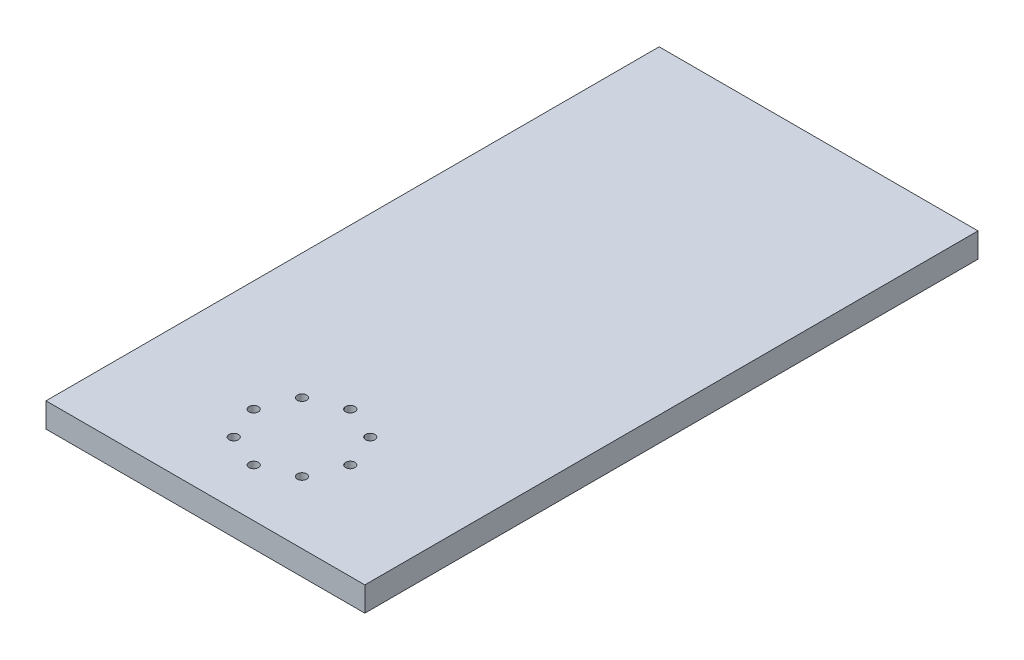
ISO-10303-21;
HEADER;
FILE_DESCRIPTION(('STEP AP214'),'2;1');
FILE_NAME('part.step','',(''),(''),'','','');
FILE_SCHEMA(('AUTOMOTIVE_DESIGN { 1 0 10303 214 1 1 1 1 }'));
ENDSEC;
DATA;
#1=APPLICATION_CONTEXT('core data for automotive mechanical design processes');
#2=APPLICATION_PROTOCOL_DEFINITION('international standard','automotive_design',2000,#1);
#3=PRODUCT_CONTEXT('',#1,'mechanical');
#4=PRODUCT('Part','Part','',(#3));
#5=PRODUCT_RELATED_PRODUCT_CATEGORY('part','',(#4));
#6=PRODUCT_DEFINITION_FORMATION('','',#4);
#7=PRODUCT_DEFINITION_CONTEXT('part definition',#1,'design');
#8=PRODUCT_DEFINITION('design','',#6,#7);
#9=PRODUCT_DEFINITION_SHAPE('','',#8);
#10=(LENGTH_UNIT() NAMED_UNIT(*) SI_UNIT(.MILLI.,.METRE.));
#11=(NAMED_UNIT(*) PLANE_ANGLE_UNIT() SI_UNIT($,.RADIAN.));
#12=(NAMED_UNIT(*) SI_UNIT($,.STERADIAN.) SOLID_ANGLE_UNIT());
#13=UNCERTAINTY_MEASURE_WITH_UNIT(LENGTH_MEASURE(1.E-05),#10,'distance_accuracy_value','');
#14=(GEOMETRIC_REPRESENTATION_CONTEXT(3) GLOBAL_UNCERTAINTY_ASSIGNED_CONTEXT((#13)) GLOBAL_UNIT_ASSIGNED_CONTEXT((#10,
#11,#12)) REPRESENTATION_CONTEXT('',''));
#15=CARTESIAN_POINT('',(0.,0.,0.));
#16=DIRECTION('',(0.,0.,1.));
#17=DIRECTION('',(1.,0.,0.));
#18=AXIS2_PLACEMENT_3D('',#15,#16,#17);
#19=CARTESIAN_POINT('',(-127.,12.7,-177.8));
#20=DIRECTION('',(0.,0.,1.));
#21=DIRECTION('',(1.,0.,0.));
#22=AXIS2_PLACEMENT_3D('',#19,#20,#21);
#23=PLANE('',#22);
#24=DIRECTION('',(0.,1.,0.));
#25=VECTOR('',#24,1.);
#26=CARTESIAN_POINT('',(98.1,0.,-177.8));
#27=LINE('',#26,#25);
#28=CARTESIAN_POINT('',(98.1,0.,-177.8));
#29=VERTEX_POINT('',#28);
#30=CARTESIAN_POINT('',(98.1,12.7,-177.8));
#31=VERTEX_POINT('',#30);
#32=EDGE_CURVE('E57',#29,#31,#27,.T.);
#33=ORIENTED_EDGE('',*,*,#32,.F.);
#34=DIRECTION('',(-1.,0.,0.));
#35=VECTOR('',#34,1.);
#36=CARTESIAN_POINT('',(-127.,0.,-177.8));
#37=LINE('',#36,#35);
#38=CARTESIAN_POINT('',(-67.,0.,-177.8));
#39=VERTEX_POINT('',#38);
#40=EDGE_CURVE('E38',#29,#39,#37,.T.);
#41=ORIENTED_EDGE('',*,*,#40,.T.);
#42=DIRECTION('',(0.,1.,0.));
#43=VECTOR('',#42,1.);
#44=CARTESIAN_POINT('',(-67.,0.,-177.8));
#45=LINE('',#44,#43);
#46=CARTESIAN_POINT('',(-67.,12.7,-177.8));
#47=VERTEX_POINT('',#46);
#48=EDGE_CURVE('E49',#39,#47,#45,.T.);
#49=ORIENTED_EDGE('',*,*,#48,.T.);
#50=DIRECTION('',(-1.,0.,0.));
#51=VECTOR('',#50,1.);
#52=CARTESIAN_POINT('',(-127.,12.7,-177.8));
#53=LINE('',#52,#51);
#54=EDGE_CURVE('E12',#31,#47,#53,.T.);
#55=ORIENTED_EDGE('',*,*,#54,.F.);
#56=EDGE_LOOP('',(#33,#41,#49,#55));
#57=FACE_BOUND('',#56,.T.);
#58=ADVANCED_FACE('F35',(#57),#23,.F.);
#59=CARTESIAN_POINT('',(0.,12.7,0.));
#60=DIRECTION('',(0.,-1.,0.));
#61=DIRECTION('',(0.,0.,-1.));
#62=AXIS2_PLACEMENT_3D('',#59,#60,#61);
#63=PLANE('',#62);
#64=CARTESIAN_POINT('',(15.55,12.7,64.6999999999999));
#65=DIRECTION('',(0.,1.,0.));
#66=DIRECTION('',(0.,0.,1.));
#67=AXIS2_PLACEMENT_3D('',#64,#65,#66);
#68=CIRCLE('',#67,2.413);
#69=CARTESIAN_POINT('',(15.55,12.7,67.113));
#70=VERTEX_POINT('',#69);
#71=EDGE_CURVE('E134',#70,#70,#68,.T.);
#72=ORIENTED_EDGE('',*,*,#71,.F.);
#73=EDGE_LOOP('',(#72));
#74=FACE_BOUND('',#73,.T.);
#75=CARTESIAN_POINT('',(-2.12766952966355,12.7,72.0223304703362));
#76=DIRECTION('',(0.,1.,0.));
#77=DIRECTION('',(0.,0.,1.));
#78=AXIS2_PLACEMENT_3D('',#75,#76,#77);
#79=CIRCLE('',#78,2.41299999999999);
#80=CARTESIAN_POINT('',(-2.12766952966355,12.7,74.4353304703362));
#81=VERTEX_POINT('',#80);
#82=EDGE_CURVE('E140',#81,#81,#79,.T.);
#83=ORIENTED_EDGE('',*,*,#82,.F.);
#84=EDGE_LOOP('',(#83));
#85=FACE_BOUND('',#84,.T.);
#86=CARTESIAN_POINT('',(-9.44999999999999,12.7,89.7));
#87=DIRECTION('',(0.,1.,0.));
#88=DIRECTION('',(0.,0.,1.));
#89=AXIS2_PLACEMENT_3D('',#86,#87,#88);
#90=CIRCLE('',#89,2.413);
#91=CARTESIAN_POINT('',(-9.44999999999999,12.7,92.113));
#92=VERTEX_POINT('',#91);
#93=EDGE_CURVE('E146',#92,#92,#90,.T.);
#94=ORIENTED_EDGE('',*,*,#93,.F.);
#95=EDGE_LOOP('',(#94));
#96=FACE_BOUND('',#95,.T.);
#97=CARTESIAN_POINT('',(-2.12766952966367,12.7,107.377669529664));
#98=DIRECTION('',(0.,1.,0.));
#99=DIRECTION('',(0.,0.,1.));
#100=AXIS2_PLACEMENT_3D('',#97,#98,#99);
#101=CIRCLE('',#100,2.413);
#102=CARTESIAN_POINT('',(-2.12766952966367,12.7,109.790669529664));
#103=VERTEX_POINT('',#102);
#104=EDGE_CURVE('E152',#103,#103,#101,.T.);
#105=ORIENTED_EDGE('',*,*,#104,.F.);
#106=EDGE_LOOP('',(#105));
#107=FACE_BOUND('',#106,.T.);
#108=CARTESIAN_POINT('',(15.55,12.7,114.7));
#109=DIRECTION('',(0.,1.,0.));
#110=DIRECTION('',(0.,0.,1.));
#111=AXIS2_PLACEMENT_3D('',#108,#109,#110);
#112=CIRCLE('',#111,2.413);
#113=CARTESIAN_POINT('',(15.55,12.7,117.113));
#114=VERTEX_POINT('',#113);
#115=EDGE_CURVE('E116',#114,#114,#112,.T.);
#116=ORIENTED_EDGE('',*,*,#115,.F.);
#117=EDGE_LOOP('',(#116));
#118=FACE_BOUND('',#117,.T.);
#119=CARTESIAN_POINT('',(33.2276695296636,12.7,107.377669529664));
#120=DIRECTION('',(0.,1.,0.));
#121=DIRECTION('',(0.,0.,1.));
#122=AXIS2_PLACEMENT_3D('',#119,#120,#121);
#123=CIRCLE('',#122,2.41299999999999);
#124=CARTESIAN_POINT('',(33.2276695296636,12.7,109.790669529664));
#125=VERTEX_POINT('',#124);
#126=EDGE_CURVE('E123',#125,#125,#123,.T.);
#127=ORIENTED_EDGE('',*,*,#126,.F.);
#128=EDGE_LOOP('',(#127));
#129=FACE_BOUND('',#128,.T.);
#130=CARTESIAN_POINT('',(40.55,12.7,89.7));
#131=DIRECTION('',(0.,1.,0.));
#132=DIRECTION('',(0.,0.,1.));
#133=AXIS2_PLACEMENT_3D('',#130,#131,#132);
#134=CIRCLE('',#133,2.41299999999999);
#135=CARTESIAN_POINT('',(40.55,12.7,92.113));
#136=VERTEX_POINT('',#135);
#137=EDGE_CURVE('E129',#136,#136,#134,.T.);
#138=ORIENTED_EDGE('',*,*,#137,.F.);
#139=EDGE_LOOP('',(#138));
#140=FACE_BOUND('',#139,.T.);
#141=CARTESIAN_POINT('',(33.2276695296637,12.7,72.0223304703363));
#142=DIRECTION('',(0.,1.,0.));
#143=DIRECTION('',(0.,0.,1.));
#144=AXIS2_PLACEMENT_3D('',#141,#142,#143);
#145=CIRCLE('',#144,2.41299999999999);
#146=CARTESIAN_POINT('',(33.2276695296637,12.7,74.4353304703363));
#147=VERTEX_POINT('',#146);
#148=EDGE_CURVE('E108',#147,#147,#145,.T.);
#149=ORIENTED_EDGE('',*,*,#148,.F.);
#150=EDGE_LOOP('',(#149));
#151=FACE_BOUND('',#150,.T.);
#152=DIRECTION('',(0.,0.,-1.));
#153=VECTOR('',#152,1.);
#154=CARTESIAN_POINT('',(98.1,12.7,-177.8));
#155=LINE('',#154,#153);
#156=CARTESIAN_POINT('',(98.1,12.7,139.7));
#157=VERTEX_POINT('',#156);
#158=EDGE_CURVE('E104',#157,#31,#155,.T.);
#159=ORIENTED_EDGE('',*,*,#158,.T.);
#160=ORIENTED_EDGE('',*,*,#54,.T.);
#161=DIRECTION('',(0.,0.,1.));
#162=VECTOR('',#161,1.);
#163=CARTESIAN_POINT('',(-67.,12.7,-177.8));
#164=LINE('',#163,#162);
#165=CARTESIAN_POINT('',(-67.,12.7,139.7));
#166=VERTEX_POINT('',#165);
#167=EDGE_CURVE('E103',#47,#166,#164,.T.);
#168=ORIENTED_EDGE('',*,*,#167,.T.);
#169=DIRECTION('',(1.,0.,0.));
#170=VECTOR('',#169,1.);
#171=CARTESIAN_POINT('',(-67.,12.7,139.7));
#172=LINE('',#171,#170);
#173=EDGE_CURVE('E83',#166,#157,#172,.T.);
#174=ORIENTED_EDGE('',*,*,#173,.T.);
#175=EDGE_LOOP('',(#159,#160,#168,#174));
#176=FACE_BOUND('',#175,.T.);
#177=ADVANCED_FACE('F101',(#74,#85,#96,#107,#118,#129,#140,#151,#176),#63,.F.);
#178=CARTESIAN_POINT('',(0.,0.,0.));
#179=DIRECTION('',(0.,-1.,0.));
#180=DIRECTION('',(0.,0.,-1.));
#181=AXIS2_PLACEMENT_3D('',#178,#179,#180);
#182=PLANE('',#181);
#183=CARTESIAN_POINT('',(15.55,0.,64.6999999999999));
#184=DIRECTION('',(0.,1.,0.));
#185=DIRECTION('',(0.,0.,1.));
#186=AXIS2_PLACEMENT_3D('',#183,#184,#185);
#187=CIRCLE('',#186,2.413);
#188=CARTESIAN_POINT('',(15.55,0.,67.113));
#189=VERTEX_POINT('',#188);
#190=EDGE_CURVE('E137',#189,#189,#187,.T.);
#191=ORIENTED_EDGE('',*,*,#190,.T.);
#192=EDGE_LOOP('',(#191));
#193=FACE_BOUND('',#192,.T.);
#194=CARTESIAN_POINT('',(-2.12766952966355,0.,72.0223304703362));
#195=DIRECTION('',(0.,1.,0.));
#196=DIRECTION('',(0.,0.,1.));
#197=AXIS2_PLACEMENT_3D('',#194,#195,#196);
#198=CIRCLE('',#197,2.41299999999999);
#199=CARTESIAN_POINT('',(-2.12766952966355,0.,74.4353304703362));
#200=VERTEX_POINT('',#199);
#201=EDGE_CURVE('E143',#200,#200,#198,.T.);
#202=ORIENTED_EDGE('',*,*,#201,.T.);
#203=EDGE_LOOP('',(#202));
#204=FACE_BOUND('',#203,.T.);
#205=CARTESIAN_POINT('',(-9.44999999999999,0.,89.7));
#206=DIRECTION('',(0.,1.,0.));
#207=DIRECTION('',(0.,0.,1.));
#208=AXIS2_PLACEMENT_3D('',#205,#206,#207);
#209=CIRCLE('',#208,2.413);
#210=CARTESIAN_POINT('',(-9.44999999999999,0.,92.113));
#211=VERTEX_POINT('',#210);
#212=EDGE_CURVE('E149',#211,#211,#209,.T.);
#213=ORIENTED_EDGE('',*,*,#212,.T.);
#214=EDGE_LOOP('',(#213));
#215=FACE_BOUND('',#214,.T.);
#216=CARTESIAN_POINT('',(-2.12766952966367,0.,107.377669529664));
#217=DIRECTION('',(0.,1.,0.));
#218=DIRECTION('',(0.,0.,1.));
#219=AXIS2_PLACEMENT_3D('',#216,#217,#218);
#220=CIRCLE('',#219,2.413);
#221=CARTESIAN_POINT('',(-2.12766952966367,0.,109.790669529664));
#222=VERTEX_POINT('',#221);
#223=EDGE_CURVE('E120',#222,#222,#220,.T.);
#224=ORIENTED_EDGE('',*,*,#223,.T.);
#225=EDGE_LOOP('',(#224));
#226=FACE_BOUND('',#225,.T.);
#227=CARTESIAN_POINT('',(15.55,0.,114.7));
#228=DIRECTION('',(0.,1.,0.));
#229=DIRECTION('',(0.,0.,1.));
#230=AXIS2_PLACEMENT_3D('',#227,#228,#229);
#231=CIRCLE('',#230,2.413);
#232=CARTESIAN_POINT('',(15.55,0.,117.113));
#233=VERTEX_POINT('',#232);
#234=EDGE_CURVE('E119',#233,#233,#231,.T.);
#235=ORIENTED_EDGE('',*,*,#234,.T.);
#236=EDGE_LOOP('',(#235));
#237=FACE_BOUND('',#236,.T.);
#238=CARTESIAN_POINT('',(33.2276695296636,0.,107.377669529664));
#239=DIRECTION('',(0.,1.,0.));
#240=DIRECTION('',(0.,0.,1.));
#241=AXIS2_PLACEMENT_3D('',#238,#239,#240);
#242=CIRCLE('',#241,2.41299999999999);
#243=CARTESIAN_POINT('',(33.2276695296636,0.,109.790669529664));
#244=VERTEX_POINT('',#243);
#245=EDGE_CURVE('E126',#244,#244,#242,.T.);
#246=ORIENTED_EDGE('',*,*,#245,.T.);
#247=EDGE_LOOP('',(#246));
#248=FACE_BOUND('',#247,.T.);
#249=CARTESIAN_POINT('',(40.55,0.,89.7));
#250=DIRECTION('',(0.,1.,0.));
#251=DIRECTION('',(0.,0.,1.));
#252=AXIS2_PLACEMENT_3D('',#249,#250,#251);
#253=CIRCLE('',#252,2.41299999999999);
#254=CARTESIAN_POINT('',(40.55,0.,92.113));
#255=VERTEX_POINT('',#254);
#256=EDGE_CURVE('E114',#255,#255,#253,.T.);
#257=ORIENTED_EDGE('',*,*,#256,.T.);
#258=EDGE_LOOP('',(#257));
#259=FACE_BOUND('',#258,.T.);
#260=CARTESIAN_POINT('',(33.2276695296637,0.,72.0223304703363));
#261=DIRECTION('',(0.,1.,0.));
#262=DIRECTION('',(0.,0.,1.));
#263=AXIS2_PLACEMENT_3D('',#260,#261,#262);
#264=CIRCLE('',#263,2.41299999999999);
#265=CARTESIAN_POINT('',(33.2276695296637,0.,74.4353304703363));
#266=VERTEX_POINT('',#265);
#267=EDGE_CURVE('E105',#266,#266,#264,.T.);
#268=ORIENTED_EDGE('',*,*,#267,.T.);
#269=EDGE_LOOP('',(#268));
#270=FACE_BOUND('',#269,.T.);
#271=ORIENTED_EDGE('',*,*,#40,.F.);
#272=DIRECTION('',(0.,0.,-1.));
#273=VECTOR('',#272,1.);
#274=CARTESIAN_POINT('',(98.1,0.,-177.8));
#275=LINE('',#274,#273);
#276=CARTESIAN_POINT('',(98.1,0.,139.7));
#277=VERTEX_POINT('',#276);
#278=EDGE_CURVE('E75',#277,#29,#275,.T.);
#279=ORIENTED_EDGE('',*,*,#278,.F.);
#280=DIRECTION('',(1.,0.,0.));
#281=VECTOR('',#280,1.);
#282=CARTESIAN_POINT('',(-67.,0.,139.7));
#283=LINE('',#282,#281);
#284=CARTESIAN_POINT('',(-67.,0.,139.7));
#285=VERTEX_POINT('',#284);
#286=EDGE_CURVE('E88',#285,#277,#283,.T.);
#287=ORIENTED_EDGE('',*,*,#286,.F.);
#288=DIRECTION('',(0.,0.,1.));
#289=VECTOR('',#288,1.);
#290=CARTESIAN_POINT('',(-67.,0.,-177.8));
#291=LINE('',#290,#289);
#292=EDGE_CURVE('E82',#39,#285,#291,.T.);
#293=ORIENTED_EDGE('',*,*,#292,.F.);
#294=EDGE_LOOP('',(#271,#279,#287,#293));
#295=FACE_BOUND('',#294,.T.);
#296=ADVANCED_FACE('F90',(#193,#204,#215,#226,#237,#248,#259,#270,#295),#182,.T.);
#297=CARTESIAN_POINT('',(98.1,0.,-177.8));
#298=DIRECTION('',(1.,0.,0.));
#299=DIRECTION('',(0.,0.,-1.));
#300=AXIS2_PLACEMENT_3D('',#297,#298,#299);
#301=PLANE('',#300);
#302=ORIENTED_EDGE('',*,*,#158,.F.);
#303=DIRECTION('',(0.,1.,0.));
#304=VECTOR('',#303,1.);
#305=CARTESIAN_POINT('',(98.1,0.,139.7));
#306=LINE('',#305,#304);
#307=EDGE_CURVE('E77',#277,#157,#306,.T.);
#308=ORIENTED_EDGE('',*,*,#307,.F.);
#309=ORIENTED_EDGE('',*,*,#278,.T.);
#310=ORIENTED_EDGE('',*,*,#32,.T.);
#311=EDGE_LOOP('',(#302,#308,#309,#310));
#312=FACE_BOUND('',#311,.T.);
#313=ADVANCED_FACE('F76',(#312),#301,.T.);
#314=CARTESIAN_POINT('',(-67.,0.,139.7));
#315=DIRECTION('',(0.,0.,1.));
#316=DIRECTION('',(1.,0.,0.));
#317=AXIS2_PLACEMENT_3D('',#314,#315,#316);
#318=PLANE('',#317);
#319=ORIENTED_EDGE('',*,*,#173,.F.);
#320=DIRECTION('',(0.,1.,0.));
#321=VECTOR('',#320,1.);
#322=CARTESIAN_POINT('',(-67.,0.,139.7));
#323=LINE('',#322,#321);
#324=EDGE_CURVE('E91',#285,#166,#323,.T.);
#325=ORIENTED_EDGE('',*,*,#324,.F.);
#326=ORIENTED_EDGE('',*,*,#286,.T.);
#327=ORIENTED_EDGE('',*,*,#307,.T.);
#328=EDGE_LOOP('',(#319,#325,#326,#327));
#329=FACE_BOUND('',#328,.T.);
#330=ADVANCED_FACE('F193',(#329),#318,.T.);
#331=CARTESIAN_POINT('',(-67.,0.,-177.8));
#332=DIRECTION('',(-1.,0.,0.));
#333=DIRECTION('',(0.,0.,1.));
#334=AXIS2_PLACEMENT_3D('',#331,#332,#333);
#335=PLANE('',#334);
#336=ORIENTED_EDGE('',*,*,#167,.F.);
#337=ORIENTED_EDGE('',*,*,#48,.F.);
#338=ORIENTED_EDGE('',*,*,#292,.T.);
#339=ORIENTED_EDGE('',*,*,#324,.T.);
#340=EDGE_LOOP('',(#336,#337,#338,#339));
#341=FACE_BOUND('',#340,.T.);
#342=ADVANCED_FACE('F183',(#341),#335,.T.);
#343=CARTESIAN_POINT('',(33.2276695296637,0.,72.0223304703363));
#344=DIRECTION('',(0.,1.,0.));
#345=DIRECTION('',(0.,0.,1.));
#346=AXIS2_PLACEMENT_3D('',#343,#344,#345);
#347=CYLINDRICAL_SURFACE('',#346,2.41299999999999);
#348=ORIENTED_EDGE('',*,*,#267,.F.);
#349=EDGE_LOOP('',(#348));
#350=FACE_BOUND('',#349,.T.);
#351=ORIENTED_EDGE('',*,*,#148,.T.);
#352=EDGE_LOOP('',(#351));
#353=FACE_BOUND('',#352,.T.);
#354=ADVANCED_FACE('F180',(#350,#353),#347,.F.);
#355=CARTESIAN_POINT('',(40.55,0.,89.7));
#356=DIRECTION('',(0.,1.,0.));
#357=DIRECTION('',(0.,0.,1.));
#358=AXIS2_PLACEMENT_3D('',#355,#356,#357);
#359=CYLINDRICAL_SURFACE('',#358,2.41299999999999);
#360=ORIENTED_EDGE('',*,*,#256,.F.);
#361=EDGE_LOOP('',(#360));
#362=FACE_BOUND('',#361,.T.);
#363=ORIENTED_EDGE('',*,*,#137,.T.);
#364=EDGE_LOOP('',(#363));
#365=FACE_BOUND('',#364,.T.);
#366=ADVANCED_FACE('F182',(#362,#365),#359,.F.);
#367=CARTESIAN_POINT('',(33.2276695296636,0.,107.377669529664));
#368=DIRECTION('',(0.,1.,0.));
#369=DIRECTION('',(0.,0.,1.));
#370=AXIS2_PLACEMENT_3D('',#367,#368,#369);
#371=CYLINDRICAL_SURFACE('',#370,2.41299999999999);
#372=ORIENTED_EDGE('',*,*,#245,.F.);
#373=EDGE_LOOP('',(#372));
#374=FACE_BOUND('',#373,.T.);
#375=ORIENTED_EDGE('',*,*,#126,.T.);
#376=EDGE_LOOP('',(#375));
#377=FACE_BOUND('',#376,.T.);
#378=ADVANCED_FACE('F190',(#374,#377),#371,.F.);
#379=CARTESIAN_POINT('',(15.55,0.,114.7));
#380=DIRECTION('',(0.,1.,0.));
#381=DIRECTION('',(0.,0.,1.));
#382=AXIS2_PLACEMENT_3D('',#379,#380,#381);
#383=CYLINDRICAL_SURFACE('',#382,2.413);
#384=ORIENTED_EDGE('',*,*,#234,.F.);
#385=EDGE_LOOP('',(#384));
#386=FACE_BOUND('',#385,.T.);
#387=ORIENTED_EDGE('',*,*,#115,.T.);
#388=EDGE_LOOP('',(#387));
#389=FACE_BOUND('',#388,.T.);
#390=ADVANCED_FACE('F164',(#386,#389),#383,.F.);
#391=CARTESIAN_POINT('',(-2.12766952966367,0.,107.377669529664));
#392=DIRECTION('',(0.,1.,0.));
#393=DIRECTION('',(0.,0.,1.));
#394=AXIS2_PLACEMENT_3D('',#391,#392,#393);
#395=CYLINDRICAL_SURFACE('',#394,2.413);
#396=ORIENTED_EDGE('',*,*,#223,.F.);
#397=EDGE_LOOP('',(#396));
#398=FACE_BOUND('',#397,.T.);
#399=ORIENTED_EDGE('',*,*,#104,.T.);
#400=EDGE_LOOP('',(#399));
#401=FACE_BOUND('',#400,.T.);
#402=ADVANCED_FACE('F160',(#398,#401),#395,.F.);
#403=CARTESIAN_POINT('',(-9.44999999999999,0.,89.7));
#404=DIRECTION('',(0.,1.,0.));
#405=DIRECTION('',(0.,0.,1.));
#406=AXIS2_PLACEMENT_3D('',#403,#404,#405);
#407=CYLINDRICAL_SURFACE('',#406,2.413);
#408=ORIENTED_EDGE('',*,*,#212,.F.);
#409=EDGE_LOOP('',(#408));
#410=FACE_BOUND('',#409,.T.);
#411=ORIENTED_EDGE('',*,*,#93,.T.);
#412=EDGE_LOOP('',(#411));
#413=FACE_BOUND('',#412,.T.);
#414=ADVANCED_FACE('F163',(#410,#413),#407,.F.);
#415=CARTESIAN_POINT('',(-2.12766952966355,0.,72.0223304703362));
#416=DIRECTION('',(0.,1.,0.));
#417=DIRECTION('',(0.,0.,1.));
#418=AXIS2_PLACEMENT_3D('',#415,#416,#417);
#419=CYLINDRICAL_SURFACE('',#418,2.41299999999999);
#420=ORIENTED_EDGE('',*,*,#201,.F.);
#421=EDGE_LOOP('',(#420));
#422=FACE_BOUND('',#421,.T.);
#423=ORIENTED_EDGE('',*,*,#82,.T.);
#424=EDGE_LOOP('',(#423));
#425=FACE_BOUND('',#424,.T.);
#426=ADVANCED_FACE('F267',(#422,#425),#419,.F.);
#427=CARTESIAN_POINT('',(15.55,0.,64.6999999999999));
#428=DIRECTION('',(0.,1.,0.));
#429=DIRECTION('',(0.,0.,1.));
#430=AXIS2_PLACEMENT_3D('',#427,#428,#429);
#431=CYLINDRICAL_SURFACE('',#430,2.413);
#432=ORIENTED_EDGE('',*,*,#190,.F.);
#433=EDGE_LOOP('',(#432));
#434=FACE_BOUND('',#433,.T.);
#435=ORIENTED_EDGE('',*,*,#71,.T.);
#436=EDGE_LOOP('',(#435));
#437=FACE_BOUND('',#436,.T.);
#438=ADVANCED_FACE('F276',(#434,#437),#431,.F.);
#439=CLOSED_SHELL('',(#58,#177,#296,#313,#330,#342,#354,#366,#378,#390,#402,#414,#426,#438));
#440=MANIFOLD_SOLID_BREP('B2',#439);
#441=ADVANCED_BREP_SHAPE_REPRESENTATION('',(#18,#440),#14);
#442=SHAPE_DEFINITION_REPRESENTATION(#9,#441);
ENDSEC;
END-ISO-10303-21;
